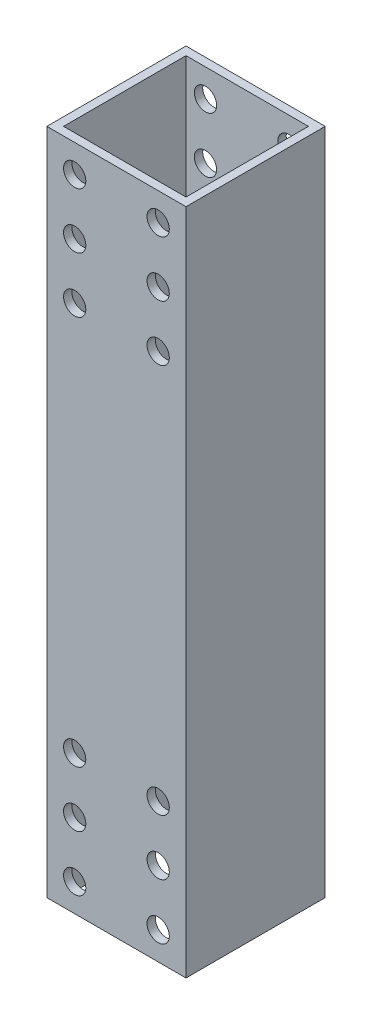
ISO-10303-21;
HEADER;
FILE_DESCRIPTION(('STEP AP214'),'2;1');
FILE_NAME('part.step','',(''),(''),'','','');
FILE_SCHEMA(('AUTOMOTIVE_DESIGN { 1 0 10303 214 1 1 1 1 }'));
ENDSEC;
DATA;
#1=APPLICATION_CONTEXT('core data for automotive mechanical design processes');
#2=APPLICATION_PROTOCOL_DEFINITION('international standard','automotive_design',2000,#1);
#3=PRODUCT_CONTEXT('',#1,'mechanical');
#4=PRODUCT('Part','Part','',(#3));
#5=PRODUCT_RELATED_PRODUCT_CATEGORY('part','',(#4));
#6=PRODUCT_DEFINITION_FORMATION('','',#4);
#7=PRODUCT_DEFINITION_CONTEXT('part definition',#1,'design');
#8=PRODUCT_DEFINITION('design','',#6,#7);
#9=PRODUCT_DEFINITION_SHAPE('','',#8);
#10=(LENGTH_UNIT() NAMED_UNIT(*) SI_UNIT(.MILLI.,.METRE.));
#11=(NAMED_UNIT(*) PLANE_ANGLE_UNIT() SI_UNIT($,.RADIAN.));
#12=(NAMED_UNIT(*) SI_UNIT($,.STERADIAN.) SOLID_ANGLE_UNIT());
#13=UNCERTAINTY_MEASURE_WITH_UNIT(LENGTH_MEASURE(1.E-05),#10,'distance_accuracy_value','');
#14=(GEOMETRIC_REPRESENTATION_CONTEXT(3) GLOBAL_UNCERTAINTY_ASSIGNED_CONTEXT((#13)) GLOBAL_UNIT_ASSIGNED_CONTEXT((#10,
#11,#12)) REPRESENTATION_CONTEXT('',''));
#15=CARTESIAN_POINT('',(0.,0.,0.));
#16=DIRECTION('',(0.,0.,1.));
#17=DIRECTION('',(1.,0.,0.));
#18=AXIS2_PLACEMENT_3D('',#15,#16,#17);
#19=CARTESIAN_POINT('',(12.5,-60.,-12.5));
#20=DIRECTION('',(1.,0.,0.));
#21=DIRECTION('',(0.,0.,-1.));
#22=AXIS2_PLACEMENT_3D('',#19,#20,#21);
#23=PLANE('',#22);
#24=DIRECTION('',(0.,1.,0.));
#25=VECTOR('',#24,1.);
#26=CARTESIAN_POINT('',(12.5,-60.,-12.5));
#27=LINE('',#26,#25);
#28=CARTESIAN_POINT('',(12.5,-60.,-12.5));
#29=VERTEX_POINT('',#28);
#30=CARTESIAN_POINT('',(12.5,60.,-12.5));
#31=VERTEX_POINT('',#30);
#32=EDGE_CURVE('E165',#29,#31,#27,.T.);
#33=ORIENTED_EDGE('',*,*,#32,.T.);
#34=DIRECTION('',(0.,0.,-1.));
#35=VECTOR('',#34,1.);
#36=CARTESIAN_POINT('',(12.5,60.,-12.5));
#37=LINE('',#36,#35);
#38=CARTESIAN_POINT('',(12.5,60.,12.5));
#39=VERTEX_POINT('',#38);
#40=EDGE_CURVE('E133',#39,#31,#37,.T.);
#41=ORIENTED_EDGE('',*,*,#40,.F.);
#42=DIRECTION('',(0.,1.,0.));
#43=VECTOR('',#42,1.);
#44=CARTESIAN_POINT('',(12.5,-60.,12.5));
#45=LINE('',#44,#43);
#46=CARTESIAN_POINT('',(12.5,-60.,12.5));
#47=VERTEX_POINT('',#46);
#48=EDGE_CURVE('E11',#47,#39,#45,.T.);
#49=ORIENTED_EDGE('',*,*,#48,.F.);
#50=DIRECTION('',(0.,0.,-1.));
#51=VECTOR('',#50,1.);
#52=CARTESIAN_POINT('',(12.5,-60.,-12.5));
#53=LINE('',#52,#51);
#54=EDGE_CURVE('E152',#47,#29,#53,.T.);
#55=ORIENTED_EDGE('',*,*,#54,.T.);
#56=EDGE_LOOP('',(#33,#41,#49,#55));
#57=FACE_BOUND('',#56,.T.);
#58=ADVANCED_FACE('F36',(#57),#23,.T.);
#59=CARTESIAN_POINT('',(-12.5,-60.,12.5));
#60=DIRECTION('',(0.,0.,1.));
#61=DIRECTION('',(1.,0.,0.));
#62=AXIS2_PLACEMENT_3D('',#59,#60,#61);
#63=PLANE('',#62);
#64=CARTESIAN_POINT('',(-7.5,-45.,12.5));
#65=DIRECTION('',(0.,0.,1.));
#66=DIRECTION('',(-1.,0.,0.));
#67=AXIS2_PLACEMENT_3D('',#64,#65,#66);
#68=CIRCLE('',#67,2.);
#69=CARTESIAN_POINT('',(-9.5,-45.,12.5));
#70=VERTEX_POINT('',#69);
#71=EDGE_CURVE('E594',#70,#70,#68,.T.);
#72=ORIENTED_EDGE('',*,*,#71,.F.);
#73=EDGE_LOOP('',(#72));
#74=FACE_BOUND('',#73,.T.);
#75=CARTESIAN_POINT('',(-7.5,-35.,12.5));
#76=DIRECTION('',(0.,0.,1.));
#77=DIRECTION('',(-1.,0.,0.));
#78=AXIS2_PLACEMENT_3D('',#75,#76,#77);
#79=CIRCLE('',#78,2.);
#80=CARTESIAN_POINT('',(-9.5,-35.,12.5));
#81=VERTEX_POINT('',#80);
#82=EDGE_CURVE('E613',#81,#81,#79,.T.);
#83=ORIENTED_EDGE('',*,*,#82,.F.);
#84=EDGE_LOOP('',(#83));
#85=FACE_BOUND('',#84,.T.);
#86=CARTESIAN_POINT('',(7.5,-55.,12.5));
#87=DIRECTION('',(0.,0.,1.));
#88=DIRECTION('',(-1.,0.,0.));
#89=AXIS2_PLACEMENT_3D('',#86,#87,#88);
#90=CIRCLE('',#89,2.);
#91=CARTESIAN_POINT('',(5.5,-55.,12.5));
#92=VERTEX_POINT('',#91);
#93=EDGE_CURVE('E607',#92,#92,#90,.T.);
#94=ORIENTED_EDGE('',*,*,#93,.F.);
#95=EDGE_LOOP('',(#94));
#96=FACE_BOUND('',#95,.T.);
#97=CARTESIAN_POINT('',(7.5,-45.,12.5));
#98=DIRECTION('',(0.,0.,1.));
#99=DIRECTION('',(-1.,0.,0.));
#100=AXIS2_PLACEMENT_3D('',#97,#98,#99);
#101=CIRCLE('',#100,2.);
#102=CARTESIAN_POINT('',(5.5,-45.,12.5));
#103=VERTEX_POINT('',#102);
#104=EDGE_CURVE('E600',#103,#103,#101,.T.);
#105=ORIENTED_EDGE('',*,*,#104,.F.);
#106=EDGE_LOOP('',(#105));
#107=FACE_BOUND('',#106,.T.);
#108=CARTESIAN_POINT('',(7.5,-35.,12.5));
#109=DIRECTION('',(0.,0.,1.));
#110=DIRECTION('',(-1.,0.,0.));
#111=AXIS2_PLACEMENT_3D('',#108,#109,#110);
#112=CIRCLE('',#111,2.);
#113=CARTESIAN_POINT('',(5.5,-35.,12.5));
#114=VERTEX_POINT('',#113);
#115=EDGE_CURVE('E601',#114,#114,#112,.T.);
#116=ORIENTED_EDGE('',*,*,#115,.F.);
#117=EDGE_LOOP('',(#116));
#118=FACE_BOUND('',#117,.T.);
#119=CARTESIAN_POINT('',(-7.5,-55.,12.5));
#120=DIRECTION('',(0.,0.,1.));
#121=DIRECTION('',(-1.,0.,0.));
#122=AXIS2_PLACEMENT_3D('',#119,#120,#121);
#123=CIRCLE('',#122,2.);
#124=CARTESIAN_POINT('',(-9.5,-55.,12.5));
#125=VERTEX_POINT('',#124);
#126=EDGE_CURVE('E199',#125,#125,#123,.T.);
#127=ORIENTED_EDGE('',*,*,#126,.F.);
#128=EDGE_LOOP('',(#127));
#129=FACE_BOUND('',#128,.T.);
#130=CARTESIAN_POINT('',(-7.5,45.,12.5));
#131=DIRECTION('',(0.,0.,-1.));
#132=DIRECTION('',(-1.,0.,0.));
#133=AXIS2_PLACEMENT_3D('',#130,#131,#132);
#134=CIRCLE('',#133,2.);
#135=CARTESIAN_POINT('',(-9.5,45.,12.5));
#136=VERTEX_POINT('',#135);
#137=EDGE_CURVE('E235',#136,#136,#134,.T.);
#138=ORIENTED_EDGE('',*,*,#137,.T.);
#139=EDGE_LOOP('',(#138));
#140=FACE_BOUND('',#139,.T.);
#141=CARTESIAN_POINT('',(-7.5,35.,12.5));
#142=DIRECTION('',(0.,0.,-1.));
#143=DIRECTION('',(-1.,0.,0.));
#144=AXIS2_PLACEMENT_3D('',#141,#142,#143);
#145=CIRCLE('',#144,2.);
#146=CARTESIAN_POINT('',(-9.5,35.,12.5));
#147=VERTEX_POINT('',#146);
#148=EDGE_CURVE('E242',#147,#147,#145,.T.);
#149=ORIENTED_EDGE('',*,*,#148,.T.);
#150=EDGE_LOOP('',(#149));
#151=FACE_BOUND('',#150,.T.);
#152=CARTESIAN_POINT('',(7.5,55.,12.5));
#153=DIRECTION('',(0.,0.,-1.));
#154=DIRECTION('',(-1.,0.,0.));
#155=AXIS2_PLACEMENT_3D('',#152,#153,#154);
#156=CIRCLE('',#155,2.);
#157=CARTESIAN_POINT('',(5.5,55.,12.5));
#158=VERTEX_POINT('',#157);
#159=EDGE_CURVE('E248',#158,#158,#156,.T.);
#160=ORIENTED_EDGE('',*,*,#159,.T.);
#161=EDGE_LOOP('',(#160));
#162=FACE_BOUND('',#161,.T.);
#163=CARTESIAN_POINT('',(7.5,45.,12.5));
#164=DIRECTION('',(0.,0.,-1.));
#165=DIRECTION('',(-1.,0.,0.));
#166=AXIS2_PLACEMENT_3D('',#163,#164,#165);
#167=CIRCLE('',#166,2.);
#168=CARTESIAN_POINT('',(5.5,45.,12.5));
#169=VERTEX_POINT('',#168);
#170=EDGE_CURVE('E254',#169,#169,#167,.T.);
#171=ORIENTED_EDGE('',*,*,#170,.T.);
#172=EDGE_LOOP('',(#171));
#173=FACE_BOUND('',#172,.T.);
#174=CARTESIAN_POINT('',(7.5,35.,12.5));
#175=DIRECTION('',(0.,0.,-1.));
#176=DIRECTION('',(-1.,0.,0.));
#177=AXIS2_PLACEMENT_3D('',#174,#175,#176);
#178=CIRCLE('',#177,2.);
#179=CARTESIAN_POINT('',(5.5,35.,12.5));
#180=VERTEX_POINT('',#179);
#181=EDGE_CURVE('E229',#180,#180,#178,.T.);
#182=ORIENTED_EDGE('',*,*,#181,.T.);
#183=EDGE_LOOP('',(#182));
#184=FACE_BOUND('',#183,.T.);
#185=CARTESIAN_POINT('',(-7.5,55.,12.5));
#186=DIRECTION('',(0.,0.,-1.));
#187=DIRECTION('',(-1.,0.,0.));
#188=AXIS2_PLACEMENT_3D('',#185,#186,#187);
#189=CIRCLE('',#188,2.);
#190=CARTESIAN_POINT('',(-9.5,55.,12.5));
#191=VERTEX_POINT('',#190);
#192=EDGE_CURVE('E175',#191,#191,#189,.T.);
#193=ORIENTED_EDGE('',*,*,#192,.T.);
#194=EDGE_LOOP('',(#193));
#195=FACE_BOUND('',#194,.T.);
#196=ORIENTED_EDGE('',*,*,#48,.T.);
#197=DIRECTION('',(1.,0.,0.));
#198=VECTOR('',#197,1.);
#199=CARTESIAN_POINT('',(-12.5,60.,12.5));
#200=LINE('',#199,#198);
#201=CARTESIAN_POINT('',(-12.5,60.,12.5));
#202=VERTEX_POINT('',#201);
#203=EDGE_CURVE('E142',#202,#39,#200,.T.);
#204=ORIENTED_EDGE('',*,*,#203,.F.);
#205=DIRECTION('',(0.,1.,0.));
#206=VECTOR('',#205,1.);
#207=CARTESIAN_POINT('',(-12.5,-60.,12.5));
#208=LINE('',#207,#206);
#209=CARTESIAN_POINT('',(-12.5,-60.,12.5));
#210=VERTEX_POINT('',#209);
#211=EDGE_CURVE('E44',#210,#202,#208,.T.);
#212=ORIENTED_EDGE('',*,*,#211,.F.);
#213=DIRECTION('',(1.,0.,0.));
#214=VECTOR('',#213,1.);
#215=CARTESIAN_POINT('',(-12.5,-60.,12.5));
#216=LINE('',#215,#214);
#217=EDGE_CURVE('E163',#210,#47,#216,.T.);
#218=ORIENTED_EDGE('',*,*,#217,.T.);
#219=EDGE_LOOP('',(#196,#204,#212,#218));
#220=FACE_BOUND('',#219,.T.);
#221=ADVANCED_FACE('F301',(#74,#85,#96,#107,#118,#129,#140,#151,#162,#173,#184,#195,#220),#63,.T.);
#222=CARTESIAN_POINT('',(-12.5,-60.,-12.5));
#223=DIRECTION('',(-1.,0.,0.));
#224=DIRECTION('',(0.,0.,1.));
#225=AXIS2_PLACEMENT_3D('',#222,#223,#224);
#226=PLANE('',#225);
#227=ORIENTED_EDGE('',*,*,#211,.T.);
#228=DIRECTION('',(0.,0.,1.));
#229=VECTOR('',#228,1.);
#230=CARTESIAN_POINT('',(-12.5,60.,-12.5));
#231=LINE('',#230,#229);
#232=CARTESIAN_POINT('',(-12.5,60.,-12.5));
#233=VERTEX_POINT('',#232);
#234=EDGE_CURVE('E139',#233,#202,#231,.T.);
#235=ORIENTED_EDGE('',*,*,#234,.F.);
#236=DIRECTION('',(0.,1.,0.));
#237=VECTOR('',#236,1.);
#238=CARTESIAN_POINT('',(-12.5,-60.,-12.5));
#239=LINE('',#238,#237);
#240=CARTESIAN_POINT('',(-12.5,-60.,-12.5));
#241=VERTEX_POINT('',#240);
#242=EDGE_CURVE('E168',#241,#233,#239,.T.);
#243=ORIENTED_EDGE('',*,*,#242,.F.);
#244=DIRECTION('',(0.,0.,1.));
#245=VECTOR('',#244,1.);
#246=CARTESIAN_POINT('',(-12.5,-60.,-12.5));
#247=LINE('',#246,#245);
#248=EDGE_CURVE('E160',#241,#210,#247,.T.);
#249=ORIENTED_EDGE('',*,*,#248,.T.);
#250=EDGE_LOOP('',(#227,#235,#243,#249));
#251=FACE_BOUND('',#250,.T.);
#252=ADVANCED_FACE('F305',(#251),#226,.T.);
#253=CARTESIAN_POINT('',(-12.5,-60.,-12.5));
#254=DIRECTION('',(0.,0.,-1.));
#255=DIRECTION('',(-1.,0.,0.));
#256=AXIS2_PLACEMENT_3D('',#253,#254,#255);
#257=PLANE('',#256);
#258=CARTESIAN_POINT('',(-7.5,-45.,-12.5));
#259=DIRECTION('',(0.,0.,1.));
#260=DIRECTION('',(-1.,0.,0.));
#261=AXIS2_PLACEMENT_3D('',#258,#259,#260);
#262=CIRCLE('',#261,2.);
#263=CARTESIAN_POINT('',(-9.5,-45.,-12.5));
#264=VERTEX_POINT('',#263);
#265=EDGE_CURVE('E573',#264,#264,#262,.T.);
#266=ORIENTED_EDGE('',*,*,#265,.T.);
#267=EDGE_LOOP('',(#266));
#268=FACE_BOUND('',#267,.T.);
#269=CARTESIAN_POINT('',(-7.5,-35.,-12.5));
#270=DIRECTION('',(0.,0.,1.));
#271=DIRECTION('',(-1.,0.,0.));
#272=AXIS2_PLACEMENT_3D('',#269,#270,#271);
#273=CIRCLE('',#272,2.);
#274=CARTESIAN_POINT('',(-9.5,-35.,-12.5));
#275=VERTEX_POINT('',#274);
#276=EDGE_CURVE('E610',#275,#275,#273,.T.);
#277=ORIENTED_EDGE('',*,*,#276,.T.);
#278=EDGE_LOOP('',(#277));
#279=FACE_BOUND('',#278,.T.);
#280=CARTESIAN_POINT('',(7.5,-55.,-12.5));
#281=DIRECTION('',(0.,0.,1.));
#282=DIRECTION('',(-1.,0.,0.));
#283=AXIS2_PLACEMENT_3D('',#280,#281,#282);
#284=CIRCLE('',#283,2.);
#285=CARTESIAN_POINT('',(5.5,-55.,-12.5));
#286=VERTEX_POINT('',#285);
#287=EDGE_CURVE('E604',#286,#286,#284,.T.);
#288=ORIENTED_EDGE('',*,*,#287,.T.);
#289=EDGE_LOOP('',(#288));
#290=FACE_BOUND('',#289,.T.);
#291=CARTESIAN_POINT('',(7.5,-45.,-12.5));
#292=DIRECTION('',(0.,0.,1.));
#293=DIRECTION('',(-1.,0.,0.));
#294=AXIS2_PLACEMENT_3D('',#291,#292,#293);
#295=CIRCLE('',#294,2.);
#296=CARTESIAN_POINT('',(5.5,-45.,-12.5));
#297=VERTEX_POINT('',#296);
#298=EDGE_CURVE('E597',#297,#297,#295,.T.);
#299=ORIENTED_EDGE('',*,*,#298,.T.);
#300=EDGE_LOOP('',(#299));
#301=FACE_BOUND('',#300,.T.);
#302=CARTESIAN_POINT('',(7.5,-35.,-12.5));
#303=DIRECTION('',(0.,0.,1.));
#304=DIRECTION('',(-1.,0.,0.));
#305=AXIS2_PLACEMENT_3D('',#302,#303,#304);
#306=CIRCLE('',#305,2.);
#307=CARTESIAN_POINT('',(5.5,-35.,-12.5));
#308=VERTEX_POINT('',#307);
#309=EDGE_CURVE('E619',#308,#308,#306,.T.);
#310=ORIENTED_EDGE('',*,*,#309,.T.);
#311=EDGE_LOOP('',(#310));
#312=FACE_BOUND('',#311,.T.);
#313=CARTESIAN_POINT('',(-7.5,-55.,-12.5));
#314=DIRECTION('',(0.,0.,1.));
#315=DIRECTION('',(-1.,0.,0.));
#316=AXIS2_PLACEMENT_3D('',#313,#314,#315);
#317=CIRCLE('',#316,2.);
#318=CARTESIAN_POINT('',(-9.5,-55.,-12.5));
#319=VERTEX_POINT('',#318);
#320=EDGE_CURVE('E590',#319,#319,#317,.T.);
#321=ORIENTED_EDGE('',*,*,#320,.T.);
#322=EDGE_LOOP('',(#321));
#323=FACE_BOUND('',#322,.T.);
#324=CARTESIAN_POINT('',(-7.5,45.,-12.5));
#325=DIRECTION('',(0.,0.,-1.));
#326=DIRECTION('',(-1.,0.,0.));
#327=AXIS2_PLACEMENT_3D('',#324,#325,#326);
#328=CIRCLE('',#327,2.);
#329=CARTESIAN_POINT('',(-9.5,45.,-12.5));
#330=VERTEX_POINT('',#329);
#331=EDGE_CURVE('E239',#330,#330,#328,.T.);
#332=ORIENTED_EDGE('',*,*,#331,.F.);
#333=EDGE_LOOP('',(#332));
#334=FACE_BOUND('',#333,.T.);
#335=CARTESIAN_POINT('',(-7.5,35.,-12.5));
#336=DIRECTION('',(0.,0.,-1.));
#337=DIRECTION('',(-1.,0.,0.));
#338=AXIS2_PLACEMENT_3D('',#335,#336,#337);
#339=CIRCLE('',#338,2.);
#340=CARTESIAN_POINT('',(-9.5,35.,-12.5));
#341=VERTEX_POINT('',#340);
#342=EDGE_CURVE('E245',#341,#341,#339,.T.);
#343=ORIENTED_EDGE('',*,*,#342,.F.);
#344=EDGE_LOOP('',(#343));
#345=FACE_BOUND('',#344,.T.);
#346=CARTESIAN_POINT('',(7.5,55.,-12.5));
#347=DIRECTION('',(0.,0.,-1.));
#348=DIRECTION('',(-1.,0.,0.));
#349=AXIS2_PLACEMENT_3D('',#346,#347,#348);
#350=CIRCLE('',#349,2.);
#351=CARTESIAN_POINT('',(5.5,55.,-12.5));
#352=VERTEX_POINT('',#351);
#353=EDGE_CURVE('E251',#352,#352,#350,.T.);
#354=ORIENTED_EDGE('',*,*,#353,.F.);
#355=EDGE_LOOP('',(#354));
#356=FACE_BOUND('',#355,.T.);
#357=CARTESIAN_POINT('',(7.5,45.,-12.5));
#358=DIRECTION('',(0.,0.,-1.));
#359=DIRECTION('',(-1.,0.,0.));
#360=AXIS2_PLACEMENT_3D('',#357,#358,#359);
#361=CIRCLE('',#360,2.);
#362=CARTESIAN_POINT('',(5.5,45.,-12.5));
#363=VERTEX_POINT('',#362);
#364=EDGE_CURVE('E232',#363,#363,#361,.T.);
#365=ORIENTED_EDGE('',*,*,#364,.F.);
#366=EDGE_LOOP('',(#365));
#367=FACE_BOUND('',#366,.T.);
#368=CARTESIAN_POINT('',(7.5,35.,-12.5));
#369=DIRECTION('',(0.,0.,-1.));
#370=DIRECTION('',(-1.,0.,0.));
#371=AXIS2_PLACEMENT_3D('',#368,#369,#370);
#372=CIRCLE('',#371,2.);
#373=CARTESIAN_POINT('',(5.5,35.,-12.5));
#374=VERTEX_POINT('',#373);
#375=EDGE_CURVE('E228',#374,#374,#372,.T.);
#376=ORIENTED_EDGE('',*,*,#375,.F.);
#377=EDGE_LOOP('',(#376));
#378=FACE_BOUND('',#377,.T.);
#379=CARTESIAN_POINT('',(-7.5,55.,-12.5));
#380=DIRECTION('',(0.,0.,-1.));
#381=DIRECTION('',(-1.,0.,0.));
#382=AXIS2_PLACEMENT_3D('',#379,#380,#381);
#383=CIRCLE('',#382,2.);
#384=CARTESIAN_POINT('',(-9.5,55.,-12.5));
#385=VERTEX_POINT('',#384);
#386=EDGE_CURVE('E238',#385,#385,#383,.T.);
#387=ORIENTED_EDGE('',*,*,#386,.F.);
#388=EDGE_LOOP('',(#387));
#389=FACE_BOUND('',#388,.T.);
#390=ORIENTED_EDGE('',*,*,#242,.T.);
#391=DIRECTION('',(-1.,0.,0.));
#392=VECTOR('',#391,1.);
#393=CARTESIAN_POINT('',(-12.5,60.,-12.5));
#394=LINE('',#393,#392);
#395=EDGE_CURVE('E136',#31,#233,#394,.T.);
#396=ORIENTED_EDGE('',*,*,#395,.F.);
#397=ORIENTED_EDGE('',*,*,#32,.F.);
#398=DIRECTION('',(-1.,0.,0.));
#399=VECTOR('',#398,1.);
#400=CARTESIAN_POINT('',(-12.5,-60.,-12.5));
#401=LINE('',#400,#399);
#402=EDGE_CURVE('E157',#29,#241,#401,.T.);
#403=ORIENTED_EDGE('',*,*,#402,.T.);
#404=EDGE_LOOP('',(#390,#396,#397,#403));
#405=FACE_BOUND('',#404,.T.);
#406=ADVANCED_FACE('F311',(#268,#279,#290,#301,#312,#323,#334,#345,#356,#367,#378,#389,#405),
#257,.T.);
#407=CARTESIAN_POINT('',(0.,-60.,0.));
#408=DIRECTION('',(0.,1.,0.));
#409=DIRECTION('',(0.,0.,1.));
#410=AXIS2_PLACEMENT_3D('',#407,#408,#409);
#411=PLANE('',#410);
#412=DIRECTION('',(0.,0.,-1.));
#413=VECTOR('',#412,1.);
#414=CARTESIAN_POINT('',(11.,-60.,-11.));
#415=LINE('',#414,#413);
#416=CARTESIAN_POINT('',(11.,-60.,11.));
#417=VERTEX_POINT('',#416);
#418=CARTESIAN_POINT('',(11.,-60.,-11.));
#419=VERTEX_POINT('',#418);
#420=EDGE_CURVE('E113',#417,#419,#415,.T.);
#421=ORIENTED_EDGE('',*,*,#420,.T.);
#422=DIRECTION('',(-1.,0.,0.));
#423=VECTOR('',#422,1.);
#424=CARTESIAN_POINT('',(-11.,-60.,-11.));
#425=LINE('',#424,#423);
#426=CARTESIAN_POINT('',(-11.,-60.,-11.));
#427=VERTEX_POINT('',#426);
#428=EDGE_CURVE('E145',#419,#427,#425,.T.);
#429=ORIENTED_EDGE('',*,*,#428,.T.);
#430=DIRECTION('',(0.,0.,1.));
#431=VECTOR('',#430,1.);
#432=CARTESIAN_POINT('',(-11.,-60.,-11.));
#433=LINE('',#432,#431);
#434=CARTESIAN_POINT('',(-11.,-60.,11.));
#435=VERTEX_POINT('',#434);
#436=EDGE_CURVE('E108',#427,#435,#433,.T.);
#437=ORIENTED_EDGE('',*,*,#436,.T.);
#438=DIRECTION('',(1.,0.,0.));
#439=VECTOR('',#438,1.);
#440=CARTESIAN_POINT('',(-11.,-60.,11.));
#441=LINE('',#440,#439);
#442=EDGE_CURVE('E52',#435,#417,#441,.T.);
#443=ORIENTED_EDGE('',*,*,#442,.T.);
#444=EDGE_LOOP('',(#421,#429,#437,#443));
#445=FACE_BOUND('',#444,.T.);
#446=ORIENTED_EDGE('',*,*,#54,.F.);
#447=ORIENTED_EDGE('',*,*,#217,.F.);
#448=ORIENTED_EDGE('',*,*,#248,.F.);
#449=ORIENTED_EDGE('',*,*,#402,.F.);
#450=EDGE_LOOP('',(#446,#447,#448,#449));
#451=FACE_BOUND('',#450,.T.);
#452=ADVANCED_FACE('F319',(#445,#451),#411,.F.);
#453=CARTESIAN_POINT('',(-11.,-60.,-11.));
#454=DIRECTION('',(0.,0.,-1.));
#455=DIRECTION('',(-1.,0.,0.));
#456=AXIS2_PLACEMENT_3D('',#453,#454,#455);
#457=PLANE('',#456);
#458=CARTESIAN_POINT('',(-7.5,-45.,-11.));
#459=DIRECTION('',(0.,0.,-1.));
#460=DIRECTION('',(-1.,0.,0.));
#461=AXIS2_PLACEMENT_3D('',#458,#459,#460);
#462=CIRCLE('',#461,2.);
#463=CARTESIAN_POINT('',(-9.5,-45.,-11.));
#464=VERTEX_POINT('',#463);
#465=EDGE_CURVE('E225',#464,#464,#462,.F.);
#466=ORIENTED_EDGE('',*,*,#465,.F.);
#467=EDGE_LOOP('',(#466));
#468=FACE_BOUND('',#467,.T.);
#469=CARTESIAN_POINT('',(-7.5,-35.,-11.));
#470=DIRECTION('',(0.,0.,-1.));
#471=DIRECTION('',(-1.,0.,0.));
#472=AXIS2_PLACEMENT_3D('',#469,#470,#471);
#473=CIRCLE('',#472,2.);
#474=CARTESIAN_POINT('',(-9.5,-35.,-11.));
#475=VERTEX_POINT('',#474);
#476=EDGE_CURVE('E213',#475,#475,#473,.F.);
#477=ORIENTED_EDGE('',*,*,#476,.F.);
#478=EDGE_LOOP('',(#477));
#479=FACE_BOUND('',#478,.T.);
#480=CARTESIAN_POINT('',(7.5,-55.,-11.));
#481=DIRECTION('',(0.,0.,-1.));
#482=DIRECTION('',(-1.,0.,0.));
#483=AXIS2_PLACEMENT_3D('',#480,#481,#482);
#484=CIRCLE('',#483,2.);
#485=CARTESIAN_POINT('',(5.5,-55.,-11.));
#486=VERTEX_POINT('',#485);
#487=EDGE_CURVE('E210',#486,#486,#484,.F.);
#488=ORIENTED_EDGE('',*,*,#487,.F.);
#489=EDGE_LOOP('',(#488));
#490=FACE_BOUND('',#489,.T.);
#491=CARTESIAN_POINT('',(7.5,-45.,-11.));
#492=DIRECTION('',(0.,0.,-1.));
#493=DIRECTION('',(-1.,0.,0.));
#494=AXIS2_PLACEMENT_3D('',#491,#492,#493);
#495=CIRCLE('',#494,2.);
#496=CARTESIAN_POINT('',(5.5,-45.,-11.));
#497=VERTEX_POINT('',#496);
#498=EDGE_CURVE('E207',#497,#497,#495,.F.);
#499=ORIENTED_EDGE('',*,*,#498,.F.);
#500=EDGE_LOOP('',(#499));
#501=FACE_BOUND('',#500,.T.);
#502=CARTESIAN_POINT('',(7.5,-35.,-11.));
#503=DIRECTION('',(0.,0.,-1.));
#504=DIRECTION('',(-1.,0.,0.));
#505=AXIS2_PLACEMENT_3D('',#502,#503,#504);
#506=CIRCLE('',#505,2.);
#507=CARTESIAN_POINT('',(5.5,-35.,-11.));
#508=VERTEX_POINT('',#507);
#509=EDGE_CURVE('E203',#508,#508,#506,.F.);
#510=ORIENTED_EDGE('',*,*,#509,.F.);
#511=EDGE_LOOP('',(#510));
#512=FACE_BOUND('',#511,.T.);
#513=CARTESIAN_POINT('',(-7.5,-55.,-11.));
#514=DIRECTION('',(0.,0.,-1.));
#515=DIRECTION('',(-1.,0.,0.));
#516=AXIS2_PLACEMENT_3D('',#513,#514,#515);
#517=CIRCLE('',#516,2.);
#518=CARTESIAN_POINT('',(-9.5,-55.,-11.));
#519=VERTEX_POINT('',#518);
#520=EDGE_CURVE('E198',#519,#519,#517,.F.);
#521=ORIENTED_EDGE('',*,*,#520,.F.);
#522=EDGE_LOOP('',(#521));
#523=FACE_BOUND('',#522,.T.);
#524=CARTESIAN_POINT('',(-7.5,45.,-11.));
#525=DIRECTION('',(0.,0.,-1.));
#526=DIRECTION('',(-1.,0.,0.));
#527=AXIS2_PLACEMENT_3D('',#524,#525,#526);
#528=CIRCLE('',#527,2.);
#529=CARTESIAN_POINT('',(-9.5,45.,-11.));
#530=VERTEX_POINT('',#529);
#531=EDGE_CURVE('E122',#530,#530,#528,.T.);
#532=ORIENTED_EDGE('',*,*,#531,.T.);
#533=EDGE_LOOP('',(#532));
#534=FACE_BOUND('',#533,.T.);
#535=CARTESIAN_POINT('',(-7.5,35.,-11.));
#536=DIRECTION('',(0.,0.,-1.));
#537=DIRECTION('',(-1.,0.,0.));
#538=AXIS2_PLACEMENT_3D('',#535,#536,#537);
#539=CIRCLE('',#538,2.);
#540=CARTESIAN_POINT('',(-9.5,35.,-11.));
#541=VERTEX_POINT('',#540);
#542=EDGE_CURVE('E191',#541,#541,#539,.T.);
#543=ORIENTED_EDGE('',*,*,#542,.T.);
#544=EDGE_LOOP('',(#543));
#545=FACE_BOUND('',#544,.T.);
#546=CARTESIAN_POINT('',(7.5,55.,-11.));
#547=DIRECTION('',(0.,0.,-1.));
#548=DIRECTION('',(-1.,0.,0.));
#549=AXIS2_PLACEMENT_3D('',#546,#547,#548);
#550=CIRCLE('',#549,2.);
#551=CARTESIAN_POINT('',(5.5,55.,-11.));
#552=VERTEX_POINT('',#551);
#553=EDGE_CURVE('E187',#552,#552,#550,.T.);
#554=ORIENTED_EDGE('',*,*,#553,.T.);
#555=EDGE_LOOP('',(#554));
#556=FACE_BOUND('',#555,.T.);
#557=CARTESIAN_POINT('',(7.5,45.,-11.));
#558=DIRECTION('',(0.,0.,-1.));
#559=DIRECTION('',(-1.,0.,0.));
#560=AXIS2_PLACEMENT_3D('',#557,#558,#559);
#561=CIRCLE('',#560,2.);
#562=CARTESIAN_POINT('',(5.5,45.,-11.));
#563=VERTEX_POINT('',#562);
#564=EDGE_CURVE('E183',#563,#563,#561,.T.);
#565=ORIENTED_EDGE('',*,*,#564,.T.);
#566=EDGE_LOOP('',(#565));
#567=FACE_BOUND('',#566,.T.);
#568=CARTESIAN_POINT('',(7.5,35.,-11.));
#569=DIRECTION('',(0.,0.,-1.));
#570=DIRECTION('',(-1.,0.,0.));
#571=AXIS2_PLACEMENT_3D('',#568,#569,#570);
#572=CIRCLE('',#571,2.);
#573=CARTESIAN_POINT('',(5.5,35.,-11.));
#574=VERTEX_POINT('',#573);
#575=EDGE_CURVE('E179',#574,#574,#572,.T.);
#576=ORIENTED_EDGE('',*,*,#575,.T.);
#577=EDGE_LOOP('',(#576));
#578=FACE_BOUND('',#577,.T.);
#579=CARTESIAN_POINT('',(-7.5,55.,-11.));
#580=DIRECTION('',(0.,0.,-1.));
#581=DIRECTION('',(-1.,0.,0.));
#582=AXIS2_PLACEMENT_3D('',#579,#580,#581);
#583=CIRCLE('',#582,2.);
#584=CARTESIAN_POINT('',(-9.5,55.,-11.));
#585=VERTEX_POINT('',#584);
#586=EDGE_CURVE('E174',#585,#585,#583,.T.);
#587=ORIENTED_EDGE('',*,*,#586,.T.);
#588=EDGE_LOOP('',(#587));
#589=FACE_BOUND('',#588,.T.);
#590=DIRECTION('',(0.,1.,0.));
#591=VECTOR('',#590,1.);
#592=CARTESIAN_POINT('',(11.,-60.,-11.));
#593=LINE('',#592,#591);
#594=CARTESIAN_POINT('',(11.,60.,-11.));
#595=VERTEX_POINT('',#594);
#596=EDGE_CURVE('E118',#419,#595,#593,.T.);
#597=ORIENTED_EDGE('',*,*,#596,.T.);
#598=DIRECTION('',(-1.,0.,0.));
#599=VECTOR('',#598,1.);
#600=CARTESIAN_POINT('',(-11.,60.,-11.));
#601=LINE('',#600,#599);
#602=CARTESIAN_POINT('',(-11.,60.,-11.));
#603=VERTEX_POINT('',#602);
#604=EDGE_CURVE('E116',#595,#603,#601,.T.);
#605=ORIENTED_EDGE('',*,*,#604,.T.);
#606=DIRECTION('',(0.,1.,0.));
#607=VECTOR('',#606,1.);
#608=CARTESIAN_POINT('',(-11.,-60.,-11.));
#609=LINE('',#608,#607);
#610=EDGE_CURVE('E101',#427,#603,#609,.T.);
#611=ORIENTED_EDGE('',*,*,#610,.F.);
#612=ORIENTED_EDGE('',*,*,#428,.F.);
#613=EDGE_LOOP('',(#597,#605,#611,#612));
#614=FACE_BOUND('',#613,.T.);
#615=ADVANCED_FACE('F117',(#468,#479,#490,#501,#512,#523,#534,#545,#556,#567,#578,#589,#614),
#457,.F.);
#616=CARTESIAN_POINT('',(11.,-60.,-11.));
#617=DIRECTION('',(1.,0.,0.));
#618=DIRECTION('',(0.,0.,-1.));
#619=AXIS2_PLACEMENT_3D('',#616,#617,#618);
#620=PLANE('',#619);
#621=DIRECTION('',(0.,1.,0.));
#622=VECTOR('',#621,1.);
#623=CARTESIAN_POINT('',(11.,-60.,11.));
#624=LINE('',#623,#622);
#625=CARTESIAN_POINT('',(11.,60.,11.));
#626=VERTEX_POINT('',#625);
#627=EDGE_CURVE('E153',#417,#626,#624,.T.);
#628=ORIENTED_EDGE('',*,*,#627,.T.);
#629=DIRECTION('',(0.,0.,-1.));
#630=VECTOR('',#629,1.);
#631=CARTESIAN_POINT('',(11.,60.,-11.));
#632=LINE('',#631,#630);
#633=EDGE_CURVE('E128',#626,#595,#632,.T.);
#634=ORIENTED_EDGE('',*,*,#633,.T.);
#635=ORIENTED_EDGE('',*,*,#596,.F.);
#636=ORIENTED_EDGE('',*,*,#420,.F.);
#637=EDGE_LOOP('',(#628,#634,#635,#636));
#638=FACE_BOUND('',#637,.T.);
#639=ADVANCED_FACE('F333',(#638),#620,.F.);
#640=CARTESIAN_POINT('',(-11.,-60.,11.));
#641=DIRECTION('',(0.,0.,1.));
#642=DIRECTION('',(1.,0.,0.));
#643=AXIS2_PLACEMENT_3D('',#640,#641,#642);
#644=PLANE('',#643);
#645=CARTESIAN_POINT('',(-7.5,-45.,11.));
#646=DIRECTION('',(0.,0.,1.));
#647=DIRECTION('',(1.,0.,0.));
#648=AXIS2_PLACEMENT_3D('',#645,#646,#647);
#649=CIRCLE('',#648,2.);
#650=CARTESIAN_POINT('',(-5.5,-45.,11.));
#651=VERTEX_POINT('',#650);
#652=EDGE_CURVE('E39',#651,#651,#649,.F.);
#653=ORIENTED_EDGE('',*,*,#652,.F.);
#654=EDGE_LOOP('',(#653));
#655=FACE_BOUND('',#654,.T.);
#656=CARTESIAN_POINT('',(-7.5,-35.,11.));
#657=DIRECTION('',(0.,0.,1.));
#658=DIRECTION('',(1.,0.,0.));
#659=AXIS2_PLACEMENT_3D('',#656,#657,#658);
#660=CIRCLE('',#659,2.);
#661=CARTESIAN_POINT('',(-5.5,-35.,11.));
#662=VERTEX_POINT('',#661);
#663=EDGE_CURVE('E211',#662,#662,#660,.F.);
#664=ORIENTED_EDGE('',*,*,#663,.F.);
#665=EDGE_LOOP('',(#664));
#666=FACE_BOUND('',#665,.T.);
#667=CARTESIAN_POINT('',(7.5,-55.,11.));
#668=DIRECTION('',(0.,0.,1.));
#669=DIRECTION('',(1.,0.,0.));
#670=AXIS2_PLACEMENT_3D('',#667,#668,#669);
#671=CIRCLE('',#670,2.);
#672=CARTESIAN_POINT('',(9.5,-55.,11.));
#673=VERTEX_POINT('',#672);
#674=EDGE_CURVE('E208',#673,#673,#671,.F.);
#675=ORIENTED_EDGE('',*,*,#674,.F.);
#676=EDGE_LOOP('',(#675));
#677=FACE_BOUND('',#676,.T.);
#678=CARTESIAN_POINT('',(7.5,-45.,11.));
#679=DIRECTION('',(0.,0.,1.));
#680=DIRECTION('',(1.,0.,0.));
#681=AXIS2_PLACEMENT_3D('',#678,#679,#680);
#682=CIRCLE('',#681,2.);
#683=CARTESIAN_POINT('',(9.5,-45.,11.));
#684=VERTEX_POINT('',#683);
#685=EDGE_CURVE('E204',#684,#684,#682,.F.);
#686=ORIENTED_EDGE('',*,*,#685,.F.);
#687=EDGE_LOOP('',(#686));
#688=FACE_BOUND('',#687,.T.);
#689=CARTESIAN_POINT('',(7.5,-35.,11.));
#690=DIRECTION('',(0.,0.,1.));
#691=DIRECTION('',(1.,0.,0.));
#692=AXIS2_PLACEMENT_3D('',#689,#690,#691);
#693=CIRCLE('',#692,2.);
#694=CARTESIAN_POINT('',(9.5,-35.,11.));
#695=VERTEX_POINT('',#694);
#696=EDGE_CURVE('E200',#695,#695,#693,.F.);
#697=ORIENTED_EDGE('',*,*,#696,.F.);
#698=EDGE_LOOP('',(#697));
#699=FACE_BOUND('',#698,.T.);
#700=CARTESIAN_POINT('',(-7.5,-55.,11.));
#701=DIRECTION('',(0.,0.,1.));
#702=DIRECTION('',(1.,0.,0.));
#703=AXIS2_PLACEMENT_3D('',#700,#701,#702);
#704=CIRCLE('',#703,2.);
#705=CARTESIAN_POINT('',(-5.5,-55.,11.));
#706=VERTEX_POINT('',#705);
#707=EDGE_CURVE('E195',#706,#706,#704,.F.);
#708=ORIENTED_EDGE('',*,*,#707,.F.);
#709=EDGE_LOOP('',(#708));
#710=FACE_BOUND('',#709,.T.);
#711=CARTESIAN_POINT('',(-7.5,45.,11.));
#712=DIRECTION('',(0.,0.,1.));
#713=DIRECTION('',(1.,0.,0.));
#714=AXIS2_PLACEMENT_3D('',#711,#712,#713);
#715=CIRCLE('',#714,2.);
#716=CARTESIAN_POINT('',(-5.5,45.,11.));
#717=VERTEX_POINT('',#716);
#718=EDGE_CURVE('E192',#717,#717,#715,.T.);
#719=ORIENTED_EDGE('',*,*,#718,.T.);
#720=EDGE_LOOP('',(#719));
#721=FACE_BOUND('',#720,.T.);
#722=CARTESIAN_POINT('',(-7.5,35.,11.));
#723=DIRECTION('',(0.,0.,1.));
#724=DIRECTION('',(1.,0.,0.));
#725=AXIS2_PLACEMENT_3D('',#722,#723,#724);
#726=CIRCLE('',#725,2.);
#727=CARTESIAN_POINT('',(-5.5,35.,11.));
#728=VERTEX_POINT('',#727);
#729=EDGE_CURVE('E188',#728,#728,#726,.T.);
#730=ORIENTED_EDGE('',*,*,#729,.T.);
#731=EDGE_LOOP('',(#730));
#732=FACE_BOUND('',#731,.T.);
#733=CARTESIAN_POINT('',(7.5,55.,11.));
#734=DIRECTION('',(0.,0.,1.));
#735=DIRECTION('',(1.,0.,0.));
#736=AXIS2_PLACEMENT_3D('',#733,#734,#735);
#737=CIRCLE('',#736,2.);
#738=CARTESIAN_POINT('',(9.5,55.,11.));
#739=VERTEX_POINT('',#738);
#740=EDGE_CURVE('E184',#739,#739,#737,.T.);
#741=ORIENTED_EDGE('',*,*,#740,.T.);
#742=EDGE_LOOP('',(#741));
#743=FACE_BOUND('',#742,.T.);
#744=CARTESIAN_POINT('',(7.5,45.,11.));
#745=DIRECTION('',(0.,0.,1.));
#746=DIRECTION('',(1.,0.,0.));
#747=AXIS2_PLACEMENT_3D('',#744,#745,#746);
#748=CIRCLE('',#747,2.);
#749=CARTESIAN_POINT('',(9.5,45.,11.));
#750=VERTEX_POINT('',#749);
#751=EDGE_CURVE('E180',#750,#750,#748,.T.);
#752=ORIENTED_EDGE('',*,*,#751,.T.);
#753=EDGE_LOOP('',(#752));
#754=FACE_BOUND('',#753,.T.);
#755=CARTESIAN_POINT('',(7.5,35.,11.));
#756=DIRECTION('',(0.,0.,1.));
#757=DIRECTION('',(1.,0.,0.));
#758=AXIS2_PLACEMENT_3D('',#755,#756,#757);
#759=CIRCLE('',#758,2.);
#760=CARTESIAN_POINT('',(9.5,35.,11.));
#761=VERTEX_POINT('',#760);
#762=EDGE_CURVE('E176',#761,#761,#759,.T.);
#763=ORIENTED_EDGE('',*,*,#762,.T.);
#764=EDGE_LOOP('',(#763));
#765=FACE_BOUND('',#764,.T.);
#766=CARTESIAN_POINT('',(-7.5,55.,11.));
#767=DIRECTION('',(0.,0.,1.));
#768=DIRECTION('',(1.,0.,0.));
#769=AXIS2_PLACEMENT_3D('',#766,#767,#768);
#770=CIRCLE('',#769,2.);
#771=CARTESIAN_POINT('',(-5.5,55.,11.));
#772=VERTEX_POINT('',#771);
#773=EDGE_CURVE('E171',#772,#772,#770,.T.);
#774=ORIENTED_EDGE('',*,*,#773,.T.);
#775=EDGE_LOOP('',(#774));
#776=FACE_BOUND('',#775,.T.);
#777=DIRECTION('',(0.,1.,0.));
#778=VECTOR('',#777,1.);
#779=CARTESIAN_POINT('',(-11.,-60.,11.));
#780=LINE('',#779,#778);
#781=CARTESIAN_POINT('',(-11.,60.,11.));
#782=VERTEX_POINT('',#781);
#783=EDGE_CURVE('E112',#435,#782,#780,.T.);
#784=ORIENTED_EDGE('',*,*,#783,.T.);
#785=DIRECTION('',(1.,0.,0.));
#786=VECTOR('',#785,1.);
#787=CARTESIAN_POINT('',(-11.,60.,11.));
#788=LINE('',#787,#786);
#789=EDGE_CURVE('E126',#782,#626,#788,.T.);
#790=ORIENTED_EDGE('',*,*,#789,.T.);
#791=ORIENTED_EDGE('',*,*,#627,.F.);
#792=ORIENTED_EDGE('',*,*,#442,.F.);
#793=EDGE_LOOP('',(#784,#790,#791,#792));
#794=FACE_BOUND('',#793,.T.);
#795=ADVANCED_FACE('F337',(#655,#666,#677,#688,#699,#710,#721,#732,#743,#754,#765,#776,#794),
#644,.F.);
#796=CARTESIAN_POINT('',(-11.,-60.,-11.));
#797=DIRECTION('',(-1.,0.,0.));
#798=DIRECTION('',(0.,0.,1.));
#799=AXIS2_PLACEMENT_3D('',#796,#797,#798);
#800=PLANE('',#799);
#801=ORIENTED_EDGE('',*,*,#610,.T.);
#802=DIRECTION('',(0.,0.,1.));
#803=VECTOR('',#802,1.);
#804=CARTESIAN_POINT('',(-11.,60.,-11.));
#805=LINE('',#804,#803);
#806=EDGE_CURVE('E105',#603,#782,#805,.T.);
#807=ORIENTED_EDGE('',*,*,#806,.T.);
#808=ORIENTED_EDGE('',*,*,#783,.F.);
#809=ORIENTED_EDGE('',*,*,#436,.F.);
#810=EDGE_LOOP('',(#801,#807,#808,#809));
#811=FACE_BOUND('',#810,.T.);
#812=ADVANCED_FACE('F103',(#811),#800,.F.);
#813=CARTESIAN_POINT('',(0.,60.,0.));
#814=DIRECTION('',(0.,1.,0.));
#815=DIRECTION('',(0.,0.,1.));
#816=AXIS2_PLACEMENT_3D('',#813,#814,#815);
#817=PLANE('',#816);
#818=ORIENTED_EDGE('',*,*,#40,.T.);
#819=ORIENTED_EDGE('',*,*,#395,.T.);
#820=ORIENTED_EDGE('',*,*,#234,.T.);
#821=ORIENTED_EDGE('',*,*,#203,.T.);
#822=EDGE_LOOP('',(#818,#819,#820,#821));
#823=FACE_BOUND('',#822,.T.);
#824=ORIENTED_EDGE('',*,*,#806,.F.);
#825=ORIENTED_EDGE('',*,*,#604,.F.);
#826=ORIENTED_EDGE('',*,*,#633,.F.);
#827=ORIENTED_EDGE('',*,*,#789,.F.);
#828=EDGE_LOOP('',(#824,#825,#826,#827));
#829=FACE_BOUND('',#828,.T.);
#830=ADVANCED_FACE('F124',(#823,#829),#817,.T.);
#831=CARTESIAN_POINT('',(-7.5,55.,12.5));
#832=DIRECTION('',(0.,0.,-1.));
#833=DIRECTION('',(-1.,0.,0.));
#834=AXIS2_PLACEMENT_3D('',#831,#832,#833);
#835=CYLINDRICAL_SURFACE('',#834,2.);
#836=ORIENTED_EDGE('',*,*,#192,.F.);
#837=EDGE_LOOP('',(#836));
#838=FACE_BOUND('',#837,.T.);
#839=ORIENTED_EDGE('',*,*,#773,.F.);
#840=EDGE_LOOP('',(#839));
#841=FACE_BOUND('',#840,.T.);
#842=ADVANCED_FACE('F346',(#838,#841),#835,.F.);
#843=CARTESIAN_POINT('',(7.5,35.,12.5));
#844=DIRECTION('',(0.,0.,-1.));
#845=DIRECTION('',(-1.,0.,0.));
#846=AXIS2_PLACEMENT_3D('',#843,#844,#845);
#847=CYLINDRICAL_SURFACE('',#846,2.);
#848=ORIENTED_EDGE('',*,*,#181,.F.);
#849=EDGE_LOOP('',(#848));
#850=FACE_BOUND('',#849,.T.);
#851=ORIENTED_EDGE('',*,*,#762,.F.);
#852=EDGE_LOOP('',(#851));
#853=FACE_BOUND('',#852,.T.);
#854=ADVANCED_FACE('F369',(#850,#853),#847,.F.);
#855=CARTESIAN_POINT('',(7.5,45.,12.5));
#856=DIRECTION('',(0.,0.,-1.));
#857=DIRECTION('',(-1.,0.,0.));
#858=AXIS2_PLACEMENT_3D('',#855,#856,#857);
#859=CYLINDRICAL_SURFACE('',#858,2.);
#860=ORIENTED_EDGE('',*,*,#170,.F.);
#861=EDGE_LOOP('',(#860));
#862=FACE_BOUND('',#861,.T.);
#863=ORIENTED_EDGE('',*,*,#751,.F.);
#864=EDGE_LOOP('',(#863));
#865=FACE_BOUND('',#864,.T.);
#866=ADVANCED_FACE('F355',(#862,#865),#859,.F.);
#867=CARTESIAN_POINT('',(7.5,55.,12.5));
#868=DIRECTION('',(0.,0.,-1.));
#869=DIRECTION('',(-1.,0.,0.));
#870=AXIS2_PLACEMENT_3D('',#867,#868,#869);
#871=CYLINDRICAL_SURFACE('',#870,2.);
#872=ORIENTED_EDGE('',*,*,#159,.F.);
#873=EDGE_LOOP('',(#872));
#874=FACE_BOUND('',#873,.T.);
#875=ORIENTED_EDGE('',*,*,#740,.F.);
#876=EDGE_LOOP('',(#875));
#877=FACE_BOUND('',#876,.T.);
#878=ADVANCED_FACE('F358',(#874,#877),#871,.F.);
#879=CARTESIAN_POINT('',(-7.5,35.,12.5));
#880=DIRECTION('',(0.,0.,-1.));
#881=DIRECTION('',(-1.,0.,0.));
#882=AXIS2_PLACEMENT_3D('',#879,#880,#881);
#883=CYLINDRICAL_SURFACE('',#882,2.);
#884=ORIENTED_EDGE('',*,*,#148,.F.);
#885=EDGE_LOOP('',(#884));
#886=FACE_BOUND('',#885,.T.);
#887=ORIENTED_EDGE('',*,*,#729,.F.);
#888=EDGE_LOOP('',(#887));
#889=FACE_BOUND('',#888,.T.);
#890=ADVANCED_FACE('F295',(#886,#889),#883,.F.);
#891=CARTESIAN_POINT('',(-7.5,45.,12.5));
#892=DIRECTION('',(0.,0.,-1.));
#893=DIRECTION('',(-1.,0.,0.));
#894=AXIS2_PLACEMENT_3D('',#891,#892,#893);
#895=CYLINDRICAL_SURFACE('',#894,2.);
#896=ORIENTED_EDGE('',*,*,#137,.F.);
#897=EDGE_LOOP('',(#896));
#898=FACE_BOUND('',#897,.T.);
#899=ORIENTED_EDGE('',*,*,#718,.F.);
#900=EDGE_LOOP('',(#899));
#901=FACE_BOUND('',#900,.T.);
#902=ADVANCED_FACE('F283',(#898,#901),#895,.F.);
#903=ORIENTED_EDGE('',*,*,#386,.T.);
#904=EDGE_LOOP('',(#903));
#905=FACE_BOUND('',#904,.T.);
#906=ORIENTED_EDGE('',*,*,#586,.F.);
#907=EDGE_LOOP('',(#906));
#908=FACE_BOUND('',#907,.T.);
#909=ADVANCED_FACE('F298',(#905,#908),#835,.F.);
#910=ORIENTED_EDGE('',*,*,#375,.T.);
#911=EDGE_LOOP('',(#910));
#912=FACE_BOUND('',#911,.T.);
#913=ORIENTED_EDGE('',*,*,#575,.F.);
#914=EDGE_LOOP('',(#913));
#915=FACE_BOUND('',#914,.T.);
#916=ADVANCED_FACE('F349',(#912,#915),#847,.F.);
#917=ORIENTED_EDGE('',*,*,#364,.T.);
#918=EDGE_LOOP('',(#917));
#919=FACE_BOUND('',#918,.T.);
#920=ORIENTED_EDGE('',*,*,#564,.F.);
#921=EDGE_LOOP('',(#920));
#922=FACE_BOUND('',#921,.T.);
#923=ADVANCED_FACE('F351',(#919,#922),#859,.F.);
#924=ORIENTED_EDGE('',*,*,#353,.T.);
#925=EDGE_LOOP('',(#924));
#926=FACE_BOUND('',#925,.T.);
#927=ORIENTED_EDGE('',*,*,#553,.F.);
#928=EDGE_LOOP('',(#927));
#929=FACE_BOUND('',#928,.T.);
#930=ADVANCED_FACE('F292',(#926,#929),#871,.F.);
#931=ORIENTED_EDGE('',*,*,#342,.T.);
#932=EDGE_LOOP('',(#931));
#933=FACE_BOUND('',#932,.T.);
#934=ORIENTED_EDGE('',*,*,#542,.F.);
#935=EDGE_LOOP('',(#934));
#936=FACE_BOUND('',#935,.T.);
#937=ADVANCED_FACE('F280',(#933,#936),#883,.F.);
#938=ORIENTED_EDGE('',*,*,#331,.T.);
#939=EDGE_LOOP('',(#938));
#940=FACE_BOUND('',#939,.T.);
#941=ORIENTED_EDGE('',*,*,#531,.F.);
#942=EDGE_LOOP('',(#941));
#943=FACE_BOUND('',#942,.T.);
#944=ADVANCED_FACE('F277',(#940,#943),#895,.F.);
#945=CARTESIAN_POINT('',(-7.5,-55.,12.5));
#946=DIRECTION('',(0.,0.,-1.));
#947=DIRECTION('',(-1.,0.,0.));
#948=AXIS2_PLACEMENT_3D('',#945,#946,#947);
#949=CYLINDRICAL_SURFACE('',#948,2.);
#950=ORIENTED_EDGE('',*,*,#126,.T.);
#951=EDGE_LOOP('',(#950));
#952=FACE_BOUND('',#951,.T.);
#953=ORIENTED_EDGE('',*,*,#707,.T.);
#954=EDGE_LOOP('',(#953));
#955=FACE_BOUND('',#954,.T.);
#956=ADVANCED_FACE('F279',(#952,#955),#949,.F.);
#957=CARTESIAN_POINT('',(7.5,-35.,12.5));
#958=DIRECTION('',(0.,0.,-1.));
#959=DIRECTION('',(-1.,0.,0.));
#960=AXIS2_PLACEMENT_3D('',#957,#958,#959);
#961=CYLINDRICAL_SURFACE('',#960,2.);
#962=ORIENTED_EDGE('',*,*,#115,.T.);
#963=EDGE_LOOP('',(#962));
#964=FACE_BOUND('',#963,.T.);
#965=ORIENTED_EDGE('',*,*,#696,.T.);
#966=EDGE_LOOP('',(#965));
#967=FACE_BOUND('',#966,.T.);
#968=ADVANCED_FACE('F288',(#964,#967),#961,.F.);
#969=CARTESIAN_POINT('',(7.5,-45.,12.5));
#970=DIRECTION('',(0.,0.,-1.));
#971=DIRECTION('',(-1.,0.,0.));
#972=AXIS2_PLACEMENT_3D('',#969,#970,#971);
#973=CYLINDRICAL_SURFACE('',#972,2.);
#974=ORIENTED_EDGE('',*,*,#104,.T.);
#975=EDGE_LOOP('',(#974));
#976=FACE_BOUND('',#975,.T.);
#977=ORIENTED_EDGE('',*,*,#685,.T.);
#978=EDGE_LOOP('',(#977));
#979=FACE_BOUND('',#978,.T.);
#980=ADVANCED_FACE('F473',(#976,#979),#973,.F.);
#981=CARTESIAN_POINT('',(7.5,-55.,12.5));
#982=DIRECTION('',(0.,0.,-1.));
#983=DIRECTION('',(-1.,0.,0.));
#984=AXIS2_PLACEMENT_3D('',#981,#982,#983);
#985=CYLINDRICAL_SURFACE('',#984,2.);
#986=ORIENTED_EDGE('',*,*,#93,.T.);
#987=EDGE_LOOP('',(#986));
#988=FACE_BOUND('',#987,.T.);
#989=ORIENTED_EDGE('',*,*,#674,.T.);
#990=EDGE_LOOP('',(#989));
#991=FACE_BOUND('',#990,.T.);
#992=ADVANCED_FACE('F484',(#988,#991),#985,.F.);
#993=CARTESIAN_POINT('',(-7.5,-35.,12.5));
#994=DIRECTION('',(0.,0.,-1.));
#995=DIRECTION('',(-1.,0.,0.));
#996=AXIS2_PLACEMENT_3D('',#993,#994,#995);
#997=CYLINDRICAL_SURFACE('',#996,2.);
#998=ORIENTED_EDGE('',*,*,#82,.T.);
#999=EDGE_LOOP('',(#998));
#1000=FACE_BOUND('',#999,.T.);
#1001=ORIENTED_EDGE('',*,*,#663,.T.);
#1002=EDGE_LOOP('',(#1001));
#1003=FACE_BOUND('',#1002,.T.);
#1004=ADVANCED_FACE('F495',(#1000,#1003),#997,.F.);
#1005=CARTESIAN_POINT('',(-7.5,-45.,12.5));
#1006=DIRECTION('',(0.,0.,-1.));
#1007=DIRECTION('',(-1.,0.,0.));
#1008=AXIS2_PLACEMENT_3D('',#1005,#1006,#1007);
#1009=CYLINDRICAL_SURFACE('',#1008,2.);
#1010=ORIENTED_EDGE('',*,*,#71,.T.);
#1011=EDGE_LOOP('',(#1010));
#1012=FACE_BOUND('',#1011,.T.);
#1013=ORIENTED_EDGE('',*,*,#652,.T.);
#1014=EDGE_LOOP('',(#1013));
#1015=FACE_BOUND('',#1014,.T.);
#1016=ADVANCED_FACE('F506',(#1012,#1015),#1009,.F.);
#1017=ORIENTED_EDGE('',*,*,#320,.F.);
#1018=EDGE_LOOP('',(#1017));
#1019=FACE_BOUND('',#1018,.T.);
#1020=ORIENTED_EDGE('',*,*,#520,.T.);
#1021=EDGE_LOOP('',(#1020));
#1022=FACE_BOUND('',#1021,.T.);
#1023=ADVANCED_FACE('F291',(#1019,#1022),#949,.F.);
#1024=ORIENTED_EDGE('',*,*,#309,.F.);
#1025=EDGE_LOOP('',(#1024));
#1026=FACE_BOUND('',#1025,.T.);
#1027=ORIENTED_EDGE('',*,*,#509,.T.);
#1028=EDGE_LOOP('',(#1027));
#1029=FACE_BOUND('',#1028,.T.);
#1030=ADVANCED_FACE('F476',(#1026,#1029),#961,.F.);
#1031=ORIENTED_EDGE('',*,*,#298,.F.);
#1032=EDGE_LOOP('',(#1031));
#1033=FACE_BOUND('',#1032,.T.);
#1034=ORIENTED_EDGE('',*,*,#498,.T.);
#1035=EDGE_LOOP('',(#1034));
#1036=FACE_BOUND('',#1035,.T.);
#1037=ADVANCED_FACE('F487',(#1033,#1036),#973,.F.);
#1038=ORIENTED_EDGE('',*,*,#287,.F.);
#1039=EDGE_LOOP('',(#1038));
#1040=FACE_BOUND('',#1039,.T.);
#1041=ORIENTED_EDGE('',*,*,#487,.T.);
#1042=EDGE_LOOP('',(#1041));
#1043=FACE_BOUND('',#1042,.T.);
#1044=ADVANCED_FACE('F498',(#1040,#1043),#985,.F.);
#1045=ORIENTED_EDGE('',*,*,#276,.F.);
#1046=EDGE_LOOP('',(#1045));
#1047=FACE_BOUND('',#1046,.T.);
#1048=ORIENTED_EDGE('',*,*,#476,.T.);
#1049=EDGE_LOOP('',(#1048));
#1050=FACE_BOUND('',#1049,.T.);
#1051=ADVANCED_FACE('F509',(#1047,#1050),#997,.F.);
#1052=ORIENTED_EDGE('',*,*,#265,.F.);
#1053=EDGE_LOOP('',(#1052));
#1054=FACE_BOUND('',#1053,.T.);
#1055=ORIENTED_EDGE('',*,*,#465,.T.);
#1056=EDGE_LOOP('',(#1055));
#1057=FACE_BOUND('',#1056,.T.);
#1058=ADVANCED_FACE('F519',(#1054,#1057),#1009,.F.);
#1059=CLOSED_SHELL('',(#58,#221,#252,#406,#452,#615,#639,#795,#812,#830,#842,#854,#866,#878,
#890,#902,#909,#916,#923,#930,#937,#944,#956,#968,#980,#992,#1004,#1016,#1023,#1030,#1037,#1044,
#1051,#1058));
#1060=MANIFOLD_SOLID_BREP('B2',#1059);
#1061=ADVANCED_BREP_SHAPE_REPRESENTATION('',(#18,#1060),#14);
#1062=SHAPE_DEFINITION_REPRESENTATION(#9,#1061);
ENDSEC;
END-ISO-10303-21;
